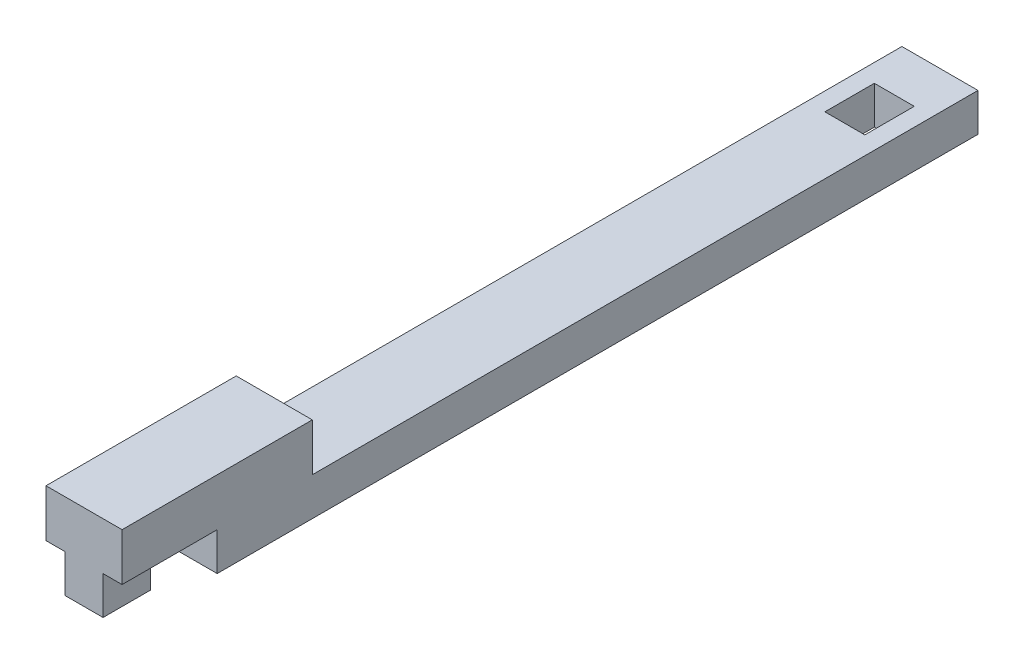
ISO-10303-21;
HEADER;
FILE_DESCRIPTION(('STEP AP214'),'2;1');
FILE_NAME('part.step','',(''),(''),'','','');
FILE_SCHEMA(('AUTOMOTIVE_DESIGN { 1 0 10303 214 1 1 1 1 }'));
ENDSEC;
DATA;
#1=APPLICATION_CONTEXT('core data for automotive mechanical design processes');
#2=APPLICATION_PROTOCOL_DEFINITION('international standard','automotive_design',2000,#1);
#3=PRODUCT_CONTEXT('',#1,'mechanical');
#4=PRODUCT('Part','Part','',(#3));
#5=PRODUCT_RELATED_PRODUCT_CATEGORY('part','',(#4));
#6=PRODUCT_DEFINITION_FORMATION('','',#4);
#7=PRODUCT_DEFINITION_CONTEXT('part definition',#1,'design');
#8=PRODUCT_DEFINITION('design','',#6,#7);
#9=PRODUCT_DEFINITION_SHAPE('','',#8);
#10=(LENGTH_UNIT() NAMED_UNIT(*) SI_UNIT(.MILLI.,.METRE.));
#11=(NAMED_UNIT(*) PLANE_ANGLE_UNIT() SI_UNIT($,.RADIAN.));
#12=(NAMED_UNIT(*) SI_UNIT($,.STERADIAN.) SOLID_ANGLE_UNIT());
#13=UNCERTAINTY_MEASURE_WITH_UNIT(LENGTH_MEASURE(1.E-05),#10,'distance_accuracy_value','');
#14=(GEOMETRIC_REPRESENTATION_CONTEXT(3) GLOBAL_UNCERTAINTY_ASSIGNED_CONTEXT((#13)) GLOBAL_UNIT_ASSIGNED_CONTEXT((#10,
#11,#12)) REPRESENTATION_CONTEXT('',''));
#15=CARTESIAN_POINT('',(0.,0.,0.));
#16=DIRECTION('',(0.,0.,1.));
#17=DIRECTION('',(1.,0.,0.));
#18=AXIS2_PLACEMENT_3D('',#15,#16,#17);
#19=CARTESIAN_POINT('',(0.,8.,20.));
#20=DIRECTION('',(0.,1.,0.));
#21=DIRECTION('',(0.,0.,1.));
#22=AXIS2_PLACEMENT_3D('',#19,#20,#21);
#23=PLANE('',#22);
#24=DIRECTION('',(0.,0.,-1.));
#25=VECTOR('',#24,1.);
#26=CARTESIAN_POINT('',(4.00000000000002,8.,20.));
#27=LINE('',#26,#25);
#28=CARTESIAN_POINT('',(4.00000000000002,8.,20.));
#29=VERTEX_POINT('',#28);
#30=CARTESIAN_POINT('',(4.00000000000002,8.,10.));
#31=VERTEX_POINT('',#30);
#32=EDGE_CURVE('E182',#29,#31,#27,.T.);
#33=ORIENTED_EDGE('',*,*,#32,.F.);
#34=DIRECTION('',(1.,0.,0.));
#35=VECTOR('',#34,1.);
#36=CARTESIAN_POINT('',(0.,8.,20.));
#37=LINE('',#36,#35);
#38=CARTESIAN_POINT('',(0.,8.,20.));
#39=VERTEX_POINT('',#38);
#40=EDGE_CURVE('E216',#39,#29,#37,.T.);
#41=ORIENTED_EDGE('',*,*,#40,.F.);
#42=DIRECTION('',(0.,0.,-1.));
#43=VECTOR('',#42,1.);
#44=CARTESIAN_POINT('',(0.,8.,20.));
#45=LINE('',#44,#43);
#46=CARTESIAN_POINT('',(0.,8.,0.));
#47=VERTEX_POINT('',#46);
#48=EDGE_CURVE('E230',#39,#47,#45,.T.);
#49=ORIENTED_EDGE('',*,*,#48,.T.);
#50=DIRECTION('',(1.,0.,0.));
#51=VECTOR('',#50,1.);
#52=CARTESIAN_POINT('',(0.,8.,0.));
#53=LINE('',#52,#51);
#54=CARTESIAN_POINT('',(16.,8.,0.));
#55=VERTEX_POINT('',#54);
#56=EDGE_CURVE('E211',#47,#55,#53,.T.);
#57=ORIENTED_EDGE('',*,*,#56,.T.);
#58=DIRECTION('',(0.,0.,-1.));
#59=VECTOR('',#58,1.);
#60=CARTESIAN_POINT('',(16.,8.,20.));
#61=LINE('',#60,#59);
#62=CARTESIAN_POINT('',(16.,8.,20.));
#63=VERTEX_POINT('',#62);
#64=EDGE_CURVE('E225',#63,#55,#61,.T.);
#65=ORIENTED_EDGE('',*,*,#64,.F.);
#66=CARTESIAN_POINT('',(12.,8.,20.));
#67=VERTEX_POINT('',#66);
#68=EDGE_CURVE('E215',#67,#63,#37,.T.);
#69=ORIENTED_EDGE('',*,*,#68,.F.);
#70=DIRECTION('',(0.,0.,1.));
#71=VECTOR('',#70,1.);
#72=CARTESIAN_POINT('',(12.,8.,20.));
#73=LINE('',#72,#71);
#74=CARTESIAN_POINT('',(12.,8.,10.));
#75=VERTEX_POINT('',#74);
#76=EDGE_CURVE('E190',#75,#67,#73,.T.);
#77=ORIENTED_EDGE('',*,*,#76,.F.);
#78=DIRECTION('',(1.,0.,0.));
#79=VECTOR('',#78,1.);
#80=CARTESIAN_POINT('',(4.00000000000002,8.,10.));
#81=LINE('',#80,#79);
#82=EDGE_CURVE('E199',#31,#75,#81,.T.);
#83=ORIENTED_EDGE('',*,*,#82,.F.);
#84=EDGE_LOOP('',(#33,#41,#49,#57,#65,#69,#77,#83));
#85=FACE_BOUND('',#84,.T.);
#86=ADVANCED_FACE('F39',(#85),#23,.F.);
#87=CARTESIAN_POINT('',(0.,8.,0.));
#88=DIRECTION('',(0.,0.,-1.));
#89=DIRECTION('',(-1.,0.,0.));
#90=AXIS2_PLACEMENT_3D('',#87,#88,#89);
#91=PLANE('',#90);
#92=ORIENTED_EDGE('',*,*,#56,.F.);
#93=DIRECTION('',(0.,-1.,0.));
#94=VECTOR('',#93,1.);
#95=CARTESIAN_POINT('',(0.,8.,0.));
#96=LINE('',#95,#94);
#97=CARTESIAN_POINT('',(0.,0.,0.));
#98=VERTEX_POINT('',#97);
#99=EDGE_CURVE('E11',#47,#98,#96,.T.);
#100=ORIENTED_EDGE('',*,*,#99,.T.);
#101=DIRECTION('',(1.,0.,0.));
#102=VECTOR('',#101,1.);
#103=CARTESIAN_POINT('',(0.,0.,0.));
#104=LINE('',#103,#102);
#105=CARTESIAN_POINT('',(16.,0.,0.));
#106=VERTEX_POINT('',#105);
#107=EDGE_CURVE('E259',#98,#106,#104,.T.);
#108=ORIENTED_EDGE('',*,*,#107,.T.);
#109=DIRECTION('',(0.,-1.,0.));
#110=VECTOR('',#109,1.);
#111=CARTESIAN_POINT('',(16.,8.,0.));
#112=LINE('',#111,#110);
#113=EDGE_CURVE('E47',#55,#106,#112,.T.);
#114=ORIENTED_EDGE('',*,*,#113,.F.);
#115=EDGE_LOOP('',(#92,#100,#108,#114));
#116=FACE_BOUND('',#115,.T.);
#117=ADVANCED_FACE('F277',(#116),#91,.F.);
#118=CARTESIAN_POINT('',(0.,8.,0.));
#119=DIRECTION('',(0.,-1.,0.));
#120=DIRECTION('',(0.,0.,-1.));
#121=AXIS2_PLACEMENT_3D('',#118,#119,#120);
#122=PLANE('',#121);
#123=DIRECTION('',(0.,0.,-1.));
#124=VECTOR('',#123,1.);
#125=CARTESIAN_POINT('',(12.2,8.,0.));
#126=LINE('',#125,#124);
#127=CARTESIAN_POINT('',(12.2,8.,-140.));
#128=VERTEX_POINT('',#127);
#129=CARTESIAN_POINT('',(12.2,8.,-150.4));
#130=VERTEX_POINT('',#129);
#131=EDGE_CURVE('E176',#128,#130,#126,.T.);
#132=ORIENTED_EDGE('',*,*,#131,.F.);
#133=DIRECTION('',(1.,0.,0.));
#134=VECTOR('',#133,1.);
#135=CARTESIAN_POINT('',(0.,8.,-140.));
#136=LINE('',#135,#134);
#137=CARTESIAN_POINT('',(3.80000000000001,8.,-140.));
#138=VERTEX_POINT('',#137);
#139=EDGE_CURVE('E54',#138,#128,#136,.T.);
#140=ORIENTED_EDGE('',*,*,#139,.F.);
#141=DIRECTION('',(0.,0.,-1.));
#142=VECTOR('',#141,1.);
#143=CARTESIAN_POINT('',(3.80000000000001,8.,0.));
#144=LINE('',#143,#142);
#145=CARTESIAN_POINT('',(3.80000000000001,8.,-150.4));
#146=VERTEX_POINT('',#145);
#147=EDGE_CURVE('E167',#138,#146,#144,.T.);
#148=ORIENTED_EDGE('',*,*,#147,.T.);
#149=DIRECTION('',(1.,0.,0.));
#150=VECTOR('',#149,1.);
#151=CARTESIAN_POINT('',(0.,8.,-150.4));
#152=LINE('',#151,#150);
#153=EDGE_CURVE('E170',#146,#130,#152,.T.);
#154=ORIENTED_EDGE('',*,*,#153,.T.);
#155=EDGE_LOOP('',(#132,#140,#148,#154));
#156=FACE_BOUND('',#155,.T.);
#157=DIRECTION('',(-1.,0.,0.));
#158=VECTOR('',#157,1.);
#159=CARTESIAN_POINT('',(0.,8.,-20.));
#160=LINE('',#159,#158);
#161=CARTESIAN_POINT('',(16.,8.,-20.));
#162=VERTEX_POINT('',#161);
#163=CARTESIAN_POINT('',(0.,8.,-20.));
#164=VERTEX_POINT('',#163);
#165=EDGE_CURVE('E233',#162,#164,#160,.T.);
#166=ORIENTED_EDGE('',*,*,#165,.F.);
#167=DIRECTION('',(0.,0.,-1.));
#168=VECTOR('',#167,1.);
#169=CARTESIAN_POINT('',(16.,8.,0.));
#170=LINE('',#169,#168);
#171=CARTESIAN_POINT('',(16.,8.,-160.));
#172=VERTEX_POINT('',#171);
#173=EDGE_CURVE('E251',#162,#172,#170,.T.);
#174=ORIENTED_EDGE('',*,*,#173,.T.);
#175=DIRECTION('',(-1.,0.,0.));
#176=VECTOR('',#175,1.);
#177=CARTESIAN_POINT('',(0.,8.,-160.));
#178=LINE('',#177,#176);
#179=CARTESIAN_POINT('',(0.,8.,-160.));
#180=VERTEX_POINT('',#179);
#181=EDGE_CURVE('E254',#172,#180,#178,.T.);
#182=ORIENTED_EDGE('',*,*,#181,.T.);
#183=DIRECTION('',(0.,0.,1.));
#184=VECTOR('',#183,1.);
#185=CARTESIAN_POINT('',(0.,8.,0.));
#186=LINE('',#185,#184);
#187=EDGE_CURVE('E249',#180,#164,#186,.T.);
#188=ORIENTED_EDGE('',*,*,#187,.T.);
#189=EDGE_LOOP('',(#166,#174,#182,#188));
#190=FACE_BOUND('',#189,.T.);
#191=ADVANCED_FACE('F290',(#156,#190),#122,.F.);
#192=CARTESIAN_POINT('',(0.,8.,0.));
#193=DIRECTION('',(1.,0.,0.));
#194=DIRECTION('',(0.,0.,-1.));
#195=AXIS2_PLACEMENT_3D('',#192,#193,#194);
#196=PLANE('',#195);
#197=DIRECTION('',(0.,0.,1.));
#198=VECTOR('',#197,1.);
#199=CARTESIAN_POINT('',(0.,0.,0.));
#200=LINE('',#199,#198);
#201=CARTESIAN_POINT('',(0.,0.,-160.));
#202=VERTEX_POINT('',#201);
#203=EDGE_CURVE('E248',#202,#98,#200,.T.);
#204=ORIENTED_EDGE('',*,*,#203,.T.);
#205=ORIENTED_EDGE('',*,*,#99,.F.);
#206=ORIENTED_EDGE('',*,*,#48,.F.);
#207=DIRECTION('',(0.,-1.,0.));
#208=VECTOR('',#207,1.);
#209=CARTESIAN_POINT('',(0.,18.,20.));
#210=LINE('',#209,#208);
#211=CARTESIAN_POINT('',(0.,18.,20.));
#212=VERTEX_POINT('',#211);
#213=EDGE_CURVE('E212',#212,#39,#210,.T.);
#214=ORIENTED_EDGE('',*,*,#213,.F.);
#215=DIRECTION('',(0.,0.,1.));
#216=VECTOR('',#215,1.);
#217=CARTESIAN_POINT('',(0.,18.,0.));
#218=LINE('',#217,#216);
#219=CARTESIAN_POINT('',(0.,18.,-20.));
#220=VERTEX_POINT('',#219);
#221=EDGE_CURVE('E234',#220,#212,#218,.T.);
#222=ORIENTED_EDGE('',*,*,#221,.F.);
#223=DIRECTION('',(0.,-1.,0.));
#224=VECTOR('',#223,1.);
#225=CARTESIAN_POINT('',(0.,18.,-20.));
#226=LINE('',#225,#224);
#227=EDGE_CURVE('E240',#220,#164,#226,.T.);
#228=ORIENTED_EDGE('',*,*,#227,.T.);
#229=ORIENTED_EDGE('',*,*,#187,.F.);
#230=DIRECTION('',(0.,-1.,0.));
#231=VECTOR('',#230,1.);
#232=CARTESIAN_POINT('',(0.,8.,-160.));
#233=LINE('',#232,#231);
#234=EDGE_CURVE('E256',#180,#202,#233,.T.);
#235=ORIENTED_EDGE('',*,*,#234,.T.);
#236=EDGE_LOOP('',(#204,#205,#206,#214,#222,#228,#229,#235));
#237=FACE_BOUND('',#236,.T.);
#238=ADVANCED_FACE('F41',(#237),#196,.F.);
#239=CARTESIAN_POINT('',(16.,8.,0.));
#240=DIRECTION('',(-1.,0.,0.));
#241=DIRECTION('',(0.,0.,1.));
#242=AXIS2_PLACEMENT_3D('',#239,#240,#241);
#243=PLANE('',#242);
#244=DIRECTION('',(0.,0.,-1.));
#245=VECTOR('',#244,1.);
#246=CARTESIAN_POINT('',(16.,0.,0.));
#247=LINE('',#246,#245);
#248=CARTESIAN_POINT('',(16.,0.,-160.));
#249=VERTEX_POINT('',#248);
#250=EDGE_CURVE('E262',#106,#249,#247,.T.);
#251=ORIENTED_EDGE('',*,*,#250,.T.);
#252=DIRECTION('',(0.,-1.,0.));
#253=VECTOR('',#252,1.);
#254=CARTESIAN_POINT('',(16.,8.,-160.));
#255=LINE('',#254,#253);
#256=EDGE_CURVE('E267',#172,#249,#255,.T.);
#257=ORIENTED_EDGE('',*,*,#256,.F.);
#258=ORIENTED_EDGE('',*,*,#173,.F.);
#259=DIRECTION('',(0.,-1.,0.));
#260=VECTOR('',#259,1.);
#261=CARTESIAN_POINT('',(16.,18.,-20.));
#262=LINE('',#261,#260);
#263=CARTESIAN_POINT('',(16.,18.,-20.));
#264=VERTEX_POINT('',#263);
#265=EDGE_CURVE('E245',#264,#162,#262,.T.);
#266=ORIENTED_EDGE('',*,*,#265,.F.);
#267=DIRECTION('',(0.,0.,-1.));
#268=VECTOR('',#267,1.);
#269=CARTESIAN_POINT('',(16.,18.,0.));
#270=LINE('',#269,#268);
#271=CARTESIAN_POINT('',(16.,18.,20.));
#272=VERTEX_POINT('',#271);
#273=EDGE_CURVE('E236',#272,#264,#270,.T.);
#274=ORIENTED_EDGE('',*,*,#273,.F.);
#275=DIRECTION('',(0.,1.,0.));
#276=VECTOR('',#275,1.);
#277=CARTESIAN_POINT('',(16.,18.,20.));
#278=LINE('',#277,#276);
#279=EDGE_CURVE('E219',#63,#272,#278,.T.);
#280=ORIENTED_EDGE('',*,*,#279,.F.);
#281=ORIENTED_EDGE('',*,*,#64,.T.);
#282=ORIENTED_EDGE('',*,*,#113,.T.);
#283=EDGE_LOOP('',(#251,#257,#258,#266,#274,#280,#281,#282));
#284=FACE_BOUND('',#283,.T.);
#285=ADVANCED_FACE('F270',(#284),#243,.F.);
#286=CARTESIAN_POINT('',(0.,8.,-160.));
#287=DIRECTION('',(0.,0.,1.));
#288=DIRECTION('',(1.,0.,0.));
#289=AXIS2_PLACEMENT_3D('',#286,#287,#288);
#290=PLANE('',#289);
#291=DIRECTION('',(-1.,0.,0.));
#292=VECTOR('',#291,1.);
#293=CARTESIAN_POINT('',(0.,0.,-160.));
#294=LINE('',#293,#292);
#295=EDGE_CURVE('E252',#249,#202,#294,.T.);
#296=ORIENTED_EDGE('',*,*,#295,.T.);
#297=ORIENTED_EDGE('',*,*,#234,.F.);
#298=ORIENTED_EDGE('',*,*,#181,.F.);
#299=ORIENTED_EDGE('',*,*,#256,.T.);
#300=EDGE_LOOP('',(#296,#297,#298,#299));
#301=FACE_BOUND('',#300,.T.);
#302=ADVANCED_FACE('F283',(#301),#290,.F.);
#303=CARTESIAN_POINT('',(0.,0.,0.));
#304=DIRECTION('',(0.,-1.,0.));
#305=DIRECTION('',(0.,0.,-1.));
#306=AXIS2_PLACEMENT_3D('',#303,#304,#305);
#307=PLANE('',#306);
#308=DIRECTION('',(1.,0.,0.));
#309=VECTOR('',#308,1.);
#310=CARTESIAN_POINT('',(0.,0.,-140.));
#311=LINE('',#310,#309);
#312=CARTESIAN_POINT('',(3.80000000000001,0.,-140.));
#313=VERTEX_POINT('',#312);
#314=CARTESIAN_POINT('',(12.2,0.,-140.));
#315=VERTEX_POINT('',#314);
#316=EDGE_CURVE('E153',#313,#315,#311,.T.);
#317=ORIENTED_EDGE('',*,*,#316,.T.);
#318=DIRECTION('',(0.,0.,-1.));
#319=VECTOR('',#318,1.);
#320=CARTESIAN_POINT('',(12.2,0.,0.));
#321=LINE('',#320,#319);
#322=CARTESIAN_POINT('',(12.2,0.,-150.4));
#323=VERTEX_POINT('',#322);
#324=EDGE_CURVE('E159',#315,#323,#321,.T.);
#325=ORIENTED_EDGE('',*,*,#324,.T.);
#326=DIRECTION('',(1.,0.,0.));
#327=VECTOR('',#326,1.);
#328=CARTESIAN_POINT('',(0.,0.,-150.4));
#329=LINE('',#328,#327);
#330=CARTESIAN_POINT('',(3.80000000000001,0.,-150.4));
#331=VERTEX_POINT('',#330);
#332=EDGE_CURVE('E163',#331,#323,#329,.T.);
#333=ORIENTED_EDGE('',*,*,#332,.F.);
#334=DIRECTION('',(0.,0.,-1.));
#335=VECTOR('',#334,1.);
#336=CARTESIAN_POINT('',(3.80000000000001,0.,0.));
#337=LINE('',#336,#335);
#338=EDGE_CURVE('E156',#313,#331,#337,.T.);
#339=ORIENTED_EDGE('',*,*,#338,.F.);
#340=EDGE_LOOP('',(#317,#325,#333,#339));
#341=FACE_BOUND('',#340,.T.);
#342=ORIENTED_EDGE('',*,*,#203,.F.);
#343=ORIENTED_EDGE('',*,*,#295,.F.);
#344=ORIENTED_EDGE('',*,*,#250,.F.);
#345=ORIENTED_EDGE('',*,*,#107,.F.);
#346=EDGE_LOOP('',(#342,#343,#344,#345));
#347=FACE_BOUND('',#346,.T.);
#348=ADVANCED_FACE('F165',(#341,#347),#307,.T.);
#349=CARTESIAN_POINT('',(0.,18.,-20.));
#350=DIRECTION('',(0.,0.,1.));
#351=DIRECTION('',(1.,0.,0.));
#352=AXIS2_PLACEMENT_3D('',#349,#350,#351);
#353=PLANE('',#352);
#354=ORIENTED_EDGE('',*,*,#165,.T.);
#355=ORIENTED_EDGE('',*,*,#227,.F.);
#356=DIRECTION('',(-1.,0.,0.));
#357=VECTOR('',#356,1.);
#358=CARTESIAN_POINT('',(0.,18.,-20.));
#359=LINE('',#358,#357);
#360=EDGE_CURVE('E238',#264,#220,#359,.T.);
#361=ORIENTED_EDGE('',*,*,#360,.F.);
#362=ORIENTED_EDGE('',*,*,#265,.T.);
#363=EDGE_LOOP('',(#354,#355,#361,#362));
#364=FACE_BOUND('',#363,.T.);
#365=ADVANCED_FACE('F293',(#364),#353,.F.);
#366=CARTESIAN_POINT('',(0.,18.,0.));
#367=DIRECTION('',(0.,-1.,0.));
#368=DIRECTION('',(0.,0.,-1.));
#369=AXIS2_PLACEMENT_3D('',#366,#367,#368);
#370=PLANE('',#369);
#371=ORIENTED_EDGE('',*,*,#221,.T.);
#372=DIRECTION('',(-1.,0.,0.));
#373=VECTOR('',#372,1.);
#374=CARTESIAN_POINT('',(0.,18.,20.));
#375=LINE('',#374,#373);
#376=EDGE_CURVE('E222',#272,#212,#375,.T.);
#377=ORIENTED_EDGE('',*,*,#376,.F.);
#378=ORIENTED_EDGE('',*,*,#273,.T.);
#379=ORIENTED_EDGE('',*,*,#360,.T.);
#380=EDGE_LOOP('',(#371,#377,#378,#379));
#381=FACE_BOUND('',#380,.T.);
#382=ADVANCED_FACE('F302',(#381),#370,.F.);
#383=CARTESIAN_POINT('',(0.,0.,20.));
#384=DIRECTION('',(0.,0.,1.));
#385=DIRECTION('',(1.,0.,0.));
#386=AXIS2_PLACEMENT_3D('',#383,#384,#385);
#387=PLANE('',#386);
#388=ORIENTED_EDGE('',*,*,#213,.T.);
#389=ORIENTED_EDGE('',*,*,#40,.T.);
#390=DIRECTION('',(0.,1.,0.));
#391=VECTOR('',#390,1.);
#392=CARTESIAN_POINT('',(4.00000000000002,0.,20.));
#393=LINE('',#392,#391);
#394=CARTESIAN_POINT('',(4.00000000000002,0.,20.));
#395=VERTEX_POINT('',#394);
#396=EDGE_CURVE('E196',#395,#29,#393,.T.);
#397=ORIENTED_EDGE('',*,*,#396,.F.);
#398=DIRECTION('',(-1.,0.,0.));
#399=VECTOR('',#398,1.);
#400=CARTESIAN_POINT('',(4.00000000000002,0.,20.));
#401=LINE('',#400,#399);
#402=CARTESIAN_POINT('',(12.,0.,20.));
#403=VERTEX_POINT('',#402);
#404=EDGE_CURVE('E194',#403,#395,#401,.T.);
#405=ORIENTED_EDGE('',*,*,#404,.F.);
#406=DIRECTION('',(0.,1.,0.));
#407=VECTOR('',#406,1.);
#408=CARTESIAN_POINT('',(12.,0.,20.));
#409=LINE('',#408,#407);
#410=EDGE_CURVE('E204',#403,#67,#409,.T.);
#411=ORIENTED_EDGE('',*,*,#410,.T.);
#412=ORIENTED_EDGE('',*,*,#68,.T.);
#413=ORIENTED_EDGE('',*,*,#279,.T.);
#414=ORIENTED_EDGE('',*,*,#376,.T.);
#415=EDGE_LOOP('',(#388,#389,#397,#405,#411,#412,#413,#414));
#416=FACE_BOUND('',#415,.T.);
#417=ADVANCED_FACE('F299',(#416),#387,.T.);
#418=CARTESIAN_POINT('',(4.00000000000002,0.,20.));
#419=DIRECTION('',(1.,0.,0.));
#420=DIRECTION('',(0.,0.,-1.));
#421=AXIS2_PLACEMENT_3D('',#418,#419,#420);
#422=PLANE('',#421);
#423=ORIENTED_EDGE('',*,*,#32,.T.);
#424=DIRECTION('',(0.,1.,0.));
#425=VECTOR('',#424,1.);
#426=CARTESIAN_POINT('',(4.00000000000002,0.,10.));
#427=LINE('',#426,#425);
#428=CARTESIAN_POINT('',(4.00000000000002,0.,10.));
#429=VERTEX_POINT('',#428);
#430=EDGE_CURVE('E209',#429,#31,#427,.T.);
#431=ORIENTED_EDGE('',*,*,#430,.F.);
#432=DIRECTION('',(0.,0.,-1.));
#433=VECTOR('',#432,1.);
#434=CARTESIAN_POINT('',(4.00000000000002,0.,20.));
#435=LINE('',#434,#433);
#436=EDGE_CURVE('E186',#395,#429,#435,.T.);
#437=ORIENTED_EDGE('',*,*,#436,.F.);
#438=ORIENTED_EDGE('',*,*,#396,.T.);
#439=EDGE_LOOP('',(#423,#431,#437,#438));
#440=FACE_BOUND('',#439,.T.);
#441=ADVANCED_FACE('F313',(#440),#422,.F.);
#442=CARTESIAN_POINT('',(4.00000000000002,0.,10.));
#443=DIRECTION('',(0.,0.,1.));
#444=DIRECTION('',(1.,0.,0.));
#445=AXIS2_PLACEMENT_3D('',#442,#443,#444);
#446=PLANE('',#445);
#447=ORIENTED_EDGE('',*,*,#82,.T.);
#448=DIRECTION('',(0.,1.,0.));
#449=VECTOR('',#448,1.);
#450=CARTESIAN_POINT('',(12.,0.,10.));
#451=LINE('',#450,#449);
#452=CARTESIAN_POINT('',(12.,0.,10.));
#453=VERTEX_POINT('',#452);
#454=EDGE_CURVE('E206',#453,#75,#451,.T.);
#455=ORIENTED_EDGE('',*,*,#454,.F.);
#456=DIRECTION('',(1.,0.,0.));
#457=VECTOR('',#456,1.);
#458=CARTESIAN_POINT('',(4.00000000000002,0.,10.));
#459=LINE('',#458,#457);
#460=EDGE_CURVE('E189',#429,#453,#459,.T.);
#461=ORIENTED_EDGE('',*,*,#460,.F.);
#462=ORIENTED_EDGE('',*,*,#430,.T.);
#463=EDGE_LOOP('',(#447,#455,#461,#462));
#464=FACE_BOUND('',#463,.T.);
#465=ADVANCED_FACE('F322',(#464),#446,.F.);
#466=CARTESIAN_POINT('',(12.,0.,20.));
#467=DIRECTION('',(-1.,0.,0.));
#468=DIRECTION('',(0.,0.,1.));
#469=AXIS2_PLACEMENT_3D('',#466,#467,#468);
#470=PLANE('',#469);
#471=ORIENTED_EDGE('',*,*,#76,.T.);
#472=ORIENTED_EDGE('',*,*,#410,.F.);
#473=DIRECTION('',(0.,0.,1.));
#474=VECTOR('',#473,1.);
#475=CARTESIAN_POINT('',(12.,0.,20.));
#476=LINE('',#475,#474);
#477=EDGE_CURVE('E192',#453,#403,#476,.T.);
#478=ORIENTED_EDGE('',*,*,#477,.F.);
#479=ORIENTED_EDGE('',*,*,#454,.T.);
#480=EDGE_LOOP('',(#471,#472,#478,#479));
#481=FACE_BOUND('',#480,.T.);
#482=ADVANCED_FACE('F320',(#481),#470,.F.);
#483=CARTESIAN_POINT('',(0.,0.,0.));
#484=DIRECTION('',(0.,-1.,0.));
#485=DIRECTION('',(0.,0.,-1.));
#486=AXIS2_PLACEMENT_3D('',#483,#484,#485);
#487=PLANE('',#486);
#488=ORIENTED_EDGE('',*,*,#436,.T.);
#489=ORIENTED_EDGE('',*,*,#460,.T.);
#490=ORIENTED_EDGE('',*,*,#477,.T.);
#491=ORIENTED_EDGE('',*,*,#404,.T.);
#492=EDGE_LOOP('',(#488,#489,#490,#491));
#493=FACE_BOUND('',#492,.T.);
#494=ADVANCED_FACE('F315',(#493),#487,.T.);
#495=CARTESIAN_POINT('',(0.,0.,-140.));
#496=DIRECTION('',(0.,0.,1.));
#497=DIRECTION('',(1.,0.,0.));
#498=AXIS2_PLACEMENT_3D('',#495,#496,#497);
#499=PLANE('',#498);
#500=ORIENTED_EDGE('',*,*,#139,.T.);
#501=DIRECTION('',(0.,1.,0.));
#502=VECTOR('',#501,1.);
#503=CARTESIAN_POINT('',(12.2,0.,-140.));
#504=LINE('',#503,#502);
#505=EDGE_CURVE('E150',#315,#128,#504,.T.);
#506=ORIENTED_EDGE('',*,*,#505,.F.);
#507=ORIENTED_EDGE('',*,*,#316,.F.);
#508=DIRECTION('',(0.,1.,0.));
#509=VECTOR('',#508,1.);
#510=CARTESIAN_POINT('',(3.80000000000001,0.,-140.));
#511=LINE('',#510,#509);
#512=EDGE_CURVE('E180',#313,#138,#511,.T.);
#513=ORIENTED_EDGE('',*,*,#512,.T.);
#514=EDGE_LOOP('',(#500,#506,#507,#513));
#515=FACE_BOUND('',#514,.T.);
#516=ADVANCED_FACE('F151',(#515),#499,.F.);
#517=CARTESIAN_POINT('',(3.80000000000001,0.,0.));
#518=DIRECTION('',(1.,0.,0.));
#519=DIRECTION('',(0.,0.,-1.));
#520=AXIS2_PLACEMENT_3D('',#517,#518,#519);
#521=PLANE('',#520);
#522=ORIENTED_EDGE('',*,*,#147,.F.);
#523=ORIENTED_EDGE('',*,*,#512,.F.);
#524=ORIENTED_EDGE('',*,*,#338,.T.);
#525=DIRECTION('',(0.,1.,0.));
#526=VECTOR('',#525,1.);
#527=CARTESIAN_POINT('',(3.80000000000001,0.,-150.4));
#528=LINE('',#527,#526);
#529=EDGE_CURVE('E183',#331,#146,#528,.T.);
#530=ORIENTED_EDGE('',*,*,#529,.T.);
#531=EDGE_LOOP('',(#522,#523,#524,#530));
#532=FACE_BOUND('',#531,.T.);
#533=ADVANCED_FACE('F447',(#532),#521,.T.);
#534=CARTESIAN_POINT('',(0.,0.,-150.4));
#535=DIRECTION('',(0.,0.,1.));
#536=DIRECTION('',(1.,0.,0.));
#537=AXIS2_PLACEMENT_3D('',#534,#535,#536);
#538=PLANE('',#537);
#539=ORIENTED_EDGE('',*,*,#153,.F.);
#540=ORIENTED_EDGE('',*,*,#529,.F.);
#541=ORIENTED_EDGE('',*,*,#332,.T.);
#542=DIRECTION('',(0.,1.,0.));
#543=VECTOR('',#542,1.);
#544=CARTESIAN_POINT('',(12.2,0.,-150.4));
#545=LINE('',#544,#543);
#546=EDGE_CURVE('E62',#323,#130,#545,.T.);
#547=ORIENTED_EDGE('',*,*,#546,.T.);
#548=EDGE_LOOP('',(#539,#540,#541,#547));
#549=FACE_BOUND('',#548,.T.);
#550=ADVANCED_FACE('F456',(#549),#538,.T.);
#551=CARTESIAN_POINT('',(12.2,0.,0.));
#552=DIRECTION('',(1.,0.,0.));
#553=DIRECTION('',(0.,0.,-1.));
#554=AXIS2_PLACEMENT_3D('',#551,#552,#553);
#555=PLANE('',#554);
#556=ORIENTED_EDGE('',*,*,#131,.T.);
#557=ORIENTED_EDGE('',*,*,#546,.F.);
#558=ORIENTED_EDGE('',*,*,#324,.F.);
#559=ORIENTED_EDGE('',*,*,#505,.T.);
#560=EDGE_LOOP('',(#556,#557,#558,#559));
#561=FACE_BOUND('',#560,.T.);
#562=ADVANCED_FACE('F160',(#561),#555,.F.);
#563=CLOSED_SHELL('',(#86,#117,#191,#238,#285,#302,#348,#365,#382,#417,#441,#465,#482,#494,#516,
#533,#550,#562));
#564=MANIFOLD_SOLID_BREP('B2',#563);
#565=ADVANCED_BREP_SHAPE_REPRESENTATION('',(#18,#564),#14);
#566=SHAPE_DEFINITION_REPRESENTATION(#9,#565);
ENDSEC;
END-ISO-10303-21;
